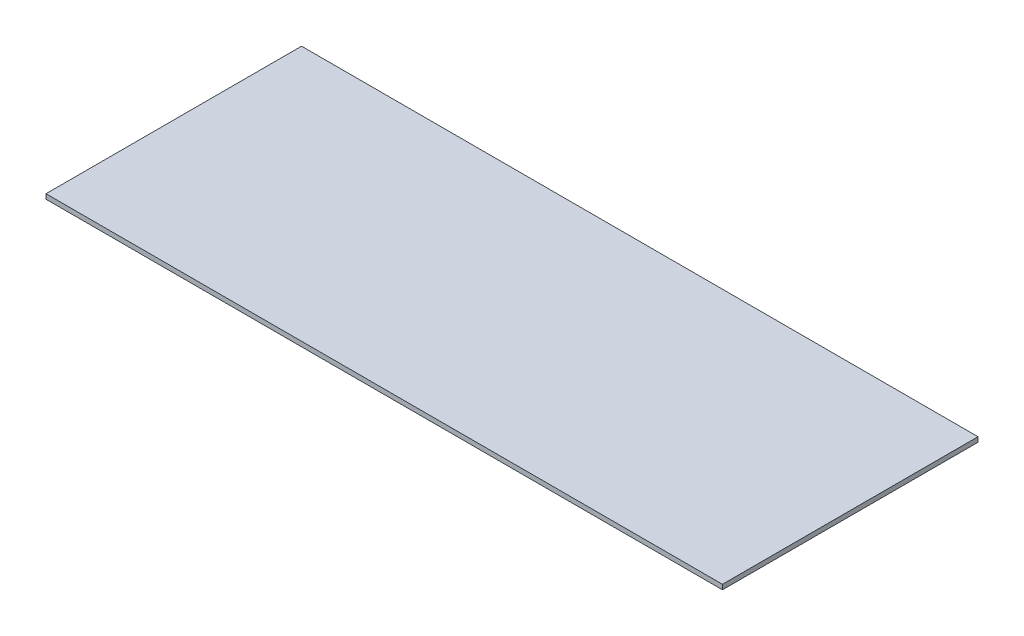
ISO-10303-21;
HEADER;
FILE_DESCRIPTION(('STEP AP214'),'2;1');
FILE_NAME('part.step','',(''),(''),'','','');
FILE_SCHEMA(('AUTOMOTIVE_DESIGN { 1 0 10303 214 1 1 1 1 }'));
ENDSEC;
DATA;
#1=APPLICATION_CONTEXT('core data for automotive mechanical design processes');
#2=APPLICATION_PROTOCOL_DEFINITION('international standard','automotive_design',2000,#1);
#3=PRODUCT_CONTEXT('',#1,'mechanical');
#4=PRODUCT('Part','Part','',(#3));
#5=PRODUCT_RELATED_PRODUCT_CATEGORY('part','',(#4));
#6=PRODUCT_DEFINITION_FORMATION('','',#4);
#7=PRODUCT_DEFINITION_CONTEXT('part definition',#1,'design');
#8=PRODUCT_DEFINITION('design','',#6,#7);
#9=PRODUCT_DEFINITION_SHAPE('','',#8);
#10=(LENGTH_UNIT() NAMED_UNIT(*) SI_UNIT(.MILLI.,.METRE.));
#11=(NAMED_UNIT(*) PLANE_ANGLE_UNIT() SI_UNIT($,.RADIAN.));
#12=(NAMED_UNIT(*) SI_UNIT($,.STERADIAN.) SOLID_ANGLE_UNIT());
#13=UNCERTAINTY_MEASURE_WITH_UNIT(LENGTH_MEASURE(1.E-05),#10,'distance_accuracy_value','');
#14=(GEOMETRIC_REPRESENTATION_CONTEXT(3) GLOBAL_UNCERTAINTY_ASSIGNED_CONTEXT((#13)) GLOBAL_UNIT_ASSIGNED_CONTEXT((#10,
#11,#12)) REPRESENTATION_CONTEXT('',''));
#15=CARTESIAN_POINT('',(0.,0.,0.));
#16=DIRECTION('',(0.,0.,1.));
#17=DIRECTION('',(1.,0.,0.));
#18=AXIS2_PLACEMENT_3D('',#15,#16,#17);
#19=CARTESIAN_POINT('',(178.59375,2.54,67.46875));
#20=DIRECTION('',(-1.,0.,0.));
#21=DIRECTION('',(0.,0.,1.));
#22=AXIS2_PLACEMENT_3D('',#19,#20,#21);
#23=PLANE('',#22);
#24=DIRECTION('',(0.,0.,-1.));
#25=VECTOR('',#24,1.);
#26=CARTESIAN_POINT('',(178.59375,0.,67.46875));
#27=LINE('',#26,#25);
#28=CARTESIAN_POINT('',(178.59375,0.,67.46875));
#29=VERTEX_POINT('',#28);
#30=CARTESIAN_POINT('',(178.59375,0.,-67.46875));
#31=VERTEX_POINT('',#30);
#32=EDGE_CURVE('E96',#29,#31,#27,.T.);
#33=ORIENTED_EDGE('',*,*,#32,.T.);
#34=DIRECTION('',(0.,-1.,0.));
#35=VECTOR('',#34,1.);
#36=CARTESIAN_POINT('',(178.59375,2.54,-67.46875));
#37=LINE('',#36,#35);
#38=CARTESIAN_POINT('',(178.59375,2.54,-67.46875));
#39=VERTEX_POINT('',#38);
#40=EDGE_CURVE('E11',#39,#31,#37,.T.);
#41=ORIENTED_EDGE('',*,*,#40,.F.);
#42=DIRECTION('',(0.,0.,-1.));
#43=VECTOR('',#42,1.);
#44=CARTESIAN_POINT('',(178.59375,2.54,67.46875));
#45=LINE('',#44,#43);
#46=CARTESIAN_POINT('',(178.59375,2.54,67.46875));
#47=VERTEX_POINT('',#46);
#48=EDGE_CURVE('E84',#47,#39,#45,.T.);
#49=ORIENTED_EDGE('',*,*,#48,.F.);
#50=DIRECTION('',(0.,-1.,0.));
#51=VECTOR('',#50,1.);
#52=CARTESIAN_POINT('',(178.59375,2.54,67.46875));
#53=LINE('',#52,#51);
#54=EDGE_CURVE('E92',#47,#29,#53,.T.);
#55=ORIENTED_EDGE('',*,*,#54,.T.);
#56=EDGE_LOOP('',(#33,#41,#49,#55));
#57=FACE_BOUND('',#56,.T.);
#58=ADVANCED_FACE('F33',(#57),#23,.F.);
#59=CARTESIAN_POINT('',(-178.59375,2.54,-67.46875));
#60=DIRECTION('',(0.,0.,1.));
#61=DIRECTION('',(1.,0.,0.));
#62=AXIS2_PLACEMENT_3D('',#59,#60,#61);
#63=PLANE('',#62);
#64=DIRECTION('',(-1.,0.,0.));
#65=VECTOR('',#64,1.);
#66=CARTESIAN_POINT('',(-178.59375,0.,-67.46875));
#67=LINE('',#66,#65);
#68=CARTESIAN_POINT('',(-178.59375,0.,-67.46875));
#69=VERTEX_POINT('',#68);
#70=EDGE_CURVE('E88',#31,#69,#67,.T.);
#71=ORIENTED_EDGE('',*,*,#70,.T.);
#72=DIRECTION('',(0.,-1.,0.));
#73=VECTOR('',#72,1.);
#74=CARTESIAN_POINT('',(-178.59375,2.54,-67.46875));
#75=LINE('',#74,#73);
#76=CARTESIAN_POINT('',(-178.59375,2.54,-67.46875));
#77=VERTEX_POINT('',#76);
#78=EDGE_CURVE('E41',#77,#69,#75,.T.);
#79=ORIENTED_EDGE('',*,*,#78,.F.);
#80=DIRECTION('',(-1.,0.,0.));
#81=VECTOR('',#80,1.);
#82=CARTESIAN_POINT('',(-178.59375,2.54,-67.46875));
#83=LINE('',#82,#81);
#84=EDGE_CURVE('E79',#39,#77,#83,.T.);
#85=ORIENTED_EDGE('',*,*,#84,.F.);
#86=ORIENTED_EDGE('',*,*,#40,.T.);
#87=EDGE_LOOP('',(#71,#79,#85,#86));
#88=FACE_BOUND('',#87,.T.);
#89=ADVANCED_FACE('F87',(#88),#63,.F.);
#90=CARTESIAN_POINT('',(-178.59375,2.54,67.46875));
#91=DIRECTION('',(1.,0.,0.));
#92=DIRECTION('',(0.,0.,-1.));
#93=AXIS2_PLACEMENT_3D('',#90,#91,#92);
#94=PLANE('',#93);
#95=DIRECTION('',(0.,0.,1.));
#96=VECTOR('',#95,1.);
#97=CARTESIAN_POINT('',(-178.59375,0.,67.46875));
#98=LINE('',#97,#96);
#99=CARTESIAN_POINT('',(-178.59375,0.,67.46875));
#100=VERTEX_POINT('',#99);
#101=EDGE_CURVE('E66',#69,#100,#98,.T.);
#102=ORIENTED_EDGE('',*,*,#101,.T.);
#103=DIRECTION('',(0.,-1.,0.));
#104=VECTOR('',#103,1.);
#105=CARTESIAN_POINT('',(-178.59375,2.54,67.46875));
#106=LINE('',#105,#104);
#107=CARTESIAN_POINT('',(-178.59375,2.54,67.46875));
#108=VERTEX_POINT('',#107);
#109=EDGE_CURVE('E89',#108,#100,#106,.T.);
#110=ORIENTED_EDGE('',*,*,#109,.F.);
#111=DIRECTION('',(0.,0.,1.));
#112=VECTOR('',#111,1.);
#113=CARTESIAN_POINT('',(-178.59375,2.54,67.46875));
#114=LINE('',#113,#112);
#115=EDGE_CURVE('E82',#77,#108,#114,.T.);
#116=ORIENTED_EDGE('',*,*,#115,.F.);
#117=ORIENTED_EDGE('',*,*,#78,.T.);
#118=EDGE_LOOP('',(#102,#110,#116,#117));
#119=FACE_BOUND('',#118,.T.);
#120=ADVANCED_FACE('F90',(#119),#94,.F.);
#121=CARTESIAN_POINT('',(-178.59375,2.54,67.46875));
#122=DIRECTION('',(0.,0.,-1.));
#123=DIRECTION('',(-1.,0.,0.));
#124=AXIS2_PLACEMENT_3D('',#121,#122,#123);
#125=PLANE('',#124);
#126=DIRECTION('',(1.,0.,0.));
#127=VECTOR('',#126,1.);
#128=CARTESIAN_POINT('',(-178.59375,0.,67.46875));
#129=LINE('',#128,#127);
#130=EDGE_CURVE('E72',#100,#29,#129,.T.);
#131=ORIENTED_EDGE('',*,*,#130,.T.);
#132=ORIENTED_EDGE('',*,*,#54,.F.);
#133=DIRECTION('',(1.,0.,0.));
#134=VECTOR('',#133,1.);
#135=CARTESIAN_POINT('',(-178.59375,2.54,67.46875));
#136=LINE('',#135,#134);
#137=EDGE_CURVE('E49',#108,#47,#136,.T.);
#138=ORIENTED_EDGE('',*,*,#137,.F.);
#139=ORIENTED_EDGE('',*,*,#109,.T.);
#140=EDGE_LOOP('',(#131,#132,#138,#139));
#141=FACE_BOUND('',#140,.T.);
#142=ADVANCED_FACE('F103',(#141),#125,.F.);
#143=CARTESIAN_POINT('',(0.,2.54,0.));
#144=DIRECTION('',(0.,-1.,0.));
#145=DIRECTION('',(0.,0.,-1.));
#146=AXIS2_PLACEMENT_3D('',#143,#144,#145);
#147=PLANE('',#146);
#148=ORIENTED_EDGE('',*,*,#48,.T.);
#149=ORIENTED_EDGE('',*,*,#84,.T.);
#150=ORIENTED_EDGE('',*,*,#115,.T.);
#151=ORIENTED_EDGE('',*,*,#137,.T.);
#152=EDGE_LOOP('',(#148,#149,#150,#151));
#153=FACE_BOUND('',#152,.T.);
#154=ADVANCED_FACE('F80',(#153),#147,.F.);
#155=CARTESIAN_POINT('',(0.,0.,0.));
#156=DIRECTION('',(0.,-1.,0.));
#157=DIRECTION('',(0.,0.,-1.));
#158=AXIS2_PLACEMENT_3D('',#155,#156,#157);
#159=PLANE('',#158);
#160=ORIENTED_EDGE('',*,*,#32,.F.);
#161=ORIENTED_EDGE('',*,*,#130,.F.);
#162=ORIENTED_EDGE('',*,*,#101,.F.);
#163=ORIENTED_EDGE('',*,*,#70,.F.);
#164=EDGE_LOOP('',(#160,#161,#162,#163));
#165=FACE_BOUND('',#164,.T.);
#166=ADVANCED_FACE('F106',(#165),#159,.T.);
#167=CLOSED_SHELL('',(#58,#89,#120,#142,#154,#166));
#168=MANIFOLD_SOLID_BREP('B2',#167);
#169=ADVANCED_BREP_SHAPE_REPRESENTATION('',(#18,#168),#14);
#170=SHAPE_DEFINITION_REPRESENTATION(#9,#169);
ENDSEC;
END-ISO-10303-21;
